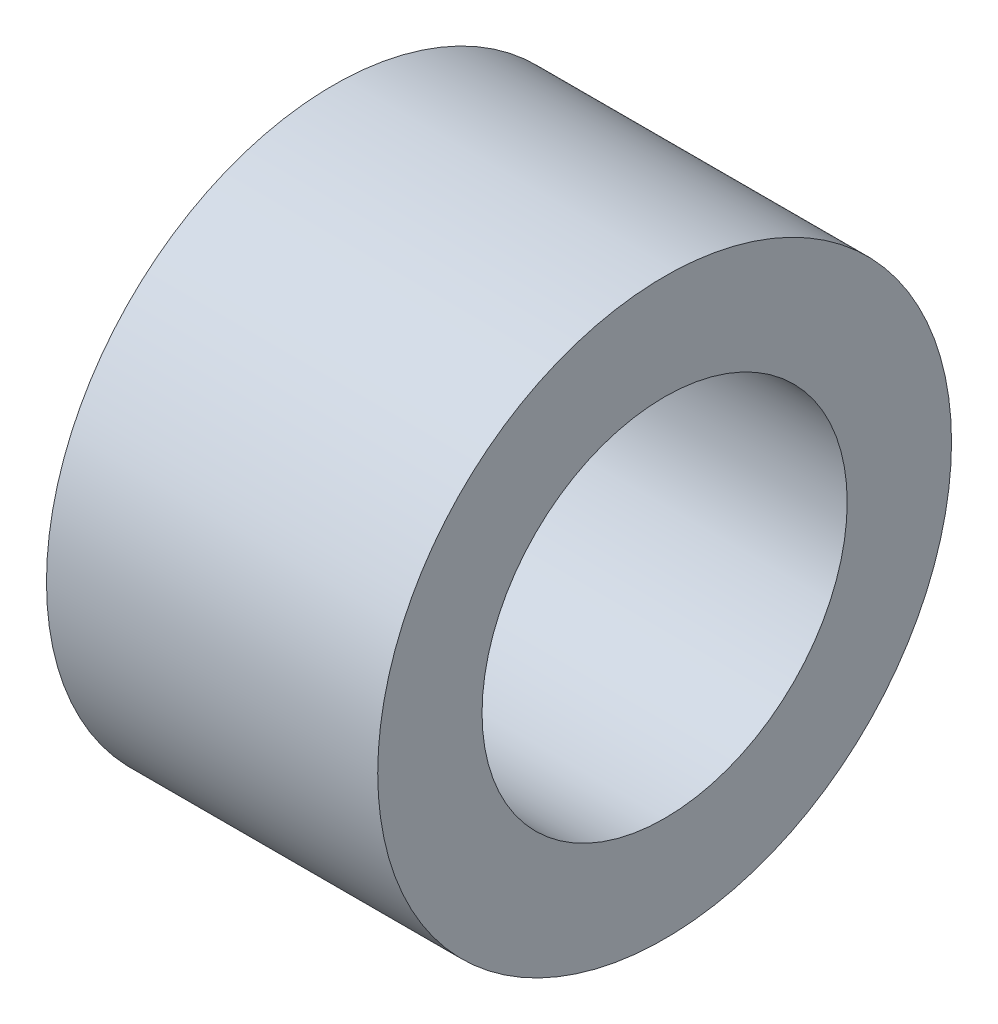
ISO-10303-21;
HEADER;
FILE_DESCRIPTION(('STEP AP214'),'2;1');
FILE_NAME('part.step','',(''),(''),'','','');
FILE_SCHEMA(('AUTOMOTIVE_DESIGN { 1 0 10303 214 1 1 1 1 }'));
ENDSEC;
DATA;
#1=APPLICATION_CONTEXT('core data for automotive mechanical design processes');
#2=APPLICATION_PROTOCOL_DEFINITION('international standard','automotive_design',2000,#1);
#3=PRODUCT_CONTEXT('',#1,'mechanical');
#4=PRODUCT('Part','Part','',(#3));
#5=PRODUCT_RELATED_PRODUCT_CATEGORY('part','',(#4));
#6=PRODUCT_DEFINITION_FORMATION('','',#4);
#7=PRODUCT_DEFINITION_CONTEXT('part definition',#1,'design');
#8=PRODUCT_DEFINITION('design','',#6,#7);
#9=PRODUCT_DEFINITION_SHAPE('','',#8);
#10=(LENGTH_UNIT() NAMED_UNIT(*) SI_UNIT(.MILLI.,.METRE.));
#11=(NAMED_UNIT(*) PLANE_ANGLE_UNIT() SI_UNIT($,.RADIAN.));
#12=(NAMED_UNIT(*) SI_UNIT($,.STERADIAN.) SOLID_ANGLE_UNIT());
#13=UNCERTAINTY_MEASURE_WITH_UNIT(LENGTH_MEASURE(1.E-05),#10,'distance_accuracy_value','');
#14=(GEOMETRIC_REPRESENTATION_CONTEXT(3) GLOBAL_UNCERTAINTY_ASSIGNED_CONTEXT((#13)) GLOBAL_UNIT_ASSIGNED_CONTEXT((#10,
#11,#12)) REPRESENTATION_CONTEXT('',''));
#15=CARTESIAN_POINT('',(0.,0.,0.));
#16=DIRECTION('',(0.,0.,1.));
#17=DIRECTION('',(1.,0.,0.));
#18=AXIS2_PLACEMENT_3D('',#15,#16,#17);
#19=CARTESIAN_POINT('',(0.,11.,0.));
#20=DIRECTION('',(1.,0.,0.));
#21=DIRECTION('',(0.,0.,-1.));
#22=AXIS2_PLACEMENT_3D('',#19,#20,#21);
#23=PLANE('',#22);
#24=CARTESIAN_POINT('',(0.,0.,0.));
#25=DIRECTION('',(-1.,0.,0.));
#26=DIRECTION('',(0.,0.,1.));
#27=AXIS2_PLACEMENT_3D('',#24,#25,#26);
#28=CIRCLE('',#27,7.);
#29=CARTESIAN_POINT('',(0.,0.,7.));
#30=VERTEX_POINT('',#29);
#31=EDGE_CURVE('E10',#30,#30,#28,.T.);
#32=ORIENTED_EDGE('',*,*,#31,.F.);
#33=EDGE_LOOP('',(#32));
#34=FACE_BOUND('',#33,.T.);
#35=CARTESIAN_POINT('',(0.,0.,0.));
#36=DIRECTION('',(-1.,0.,0.));
#37=DIRECTION('',(0.,0.,1.));
#38=AXIS2_PLACEMENT_3D('',#35,#36,#37);
#39=CIRCLE('',#38,11.);
#40=CARTESIAN_POINT('',(0.,0.,11.));
#41=VERTEX_POINT('',#40);
#42=EDGE_CURVE('E52',#41,#41,#39,.T.);
#43=ORIENTED_EDGE('',*,*,#42,.T.);
#44=EDGE_LOOP('',(#43));
#45=FACE_BOUND('',#44,.T.);
#46=ADVANCED_FACE('F39',(#34,#45),#23,.F.);
#47=CARTESIAN_POINT('',(-3000.,0.,0.));
#48=DIRECTION('',(-1.,0.,0.));
#49=DIRECTION('',(0.,0.,1.));
#50=AXIS2_PLACEMENT_3D('',#47,#48,#49);
#51=CYLINDRICAL_SURFACE('',#50,7.);
#52=CARTESIAN_POINT('',(12.7000000000002,0.,0.));
#53=DIRECTION('',(-1.,0.,0.));
#54=DIRECTION('',(0.,0.,1.));
#55=AXIS2_PLACEMENT_3D('',#52,#53,#54);
#56=CIRCLE('',#55,7.);
#57=CARTESIAN_POINT('',(12.7000000000002,0.,7.));
#58=VERTEX_POINT('',#57);
#59=EDGE_CURVE('E44',#58,#58,#56,.T.);
#60=ORIENTED_EDGE('',*,*,#59,.F.);
#61=EDGE_LOOP('',(#60));
#62=FACE_BOUND('',#61,.T.);
#63=ORIENTED_EDGE('',*,*,#31,.T.);
#64=EDGE_LOOP('',(#63));
#65=FACE_BOUND('',#64,.T.);
#66=ADVANCED_FACE('F67',(#62,#65),#51,.F.);
#67=CARTESIAN_POINT('',(12.7,7.,0.));
#68=DIRECTION('',(-1.,0.,0.));
#69=DIRECTION('',(0.,0.,1.));
#70=AXIS2_PLACEMENT_3D('',#67,#68,#69);
#71=PLANE('',#70);
#72=CARTESIAN_POINT('',(12.7000000000002,0.,0.));
#73=DIRECTION('',(-1.,0.,0.));
#74=DIRECTION('',(0.,0.,1.));
#75=AXIS2_PLACEMENT_3D('',#72,#73,#74);
#76=CIRCLE('',#75,11.);
#77=CARTESIAN_POINT('',(12.7000000000002,0.,11.));
#78=VERTEX_POINT('',#77);
#79=EDGE_CURVE('E47',#78,#78,#76,.T.);
#80=ORIENTED_EDGE('',*,*,#79,.F.);
#81=EDGE_LOOP('',(#80));
#82=FACE_BOUND('',#81,.T.);
#83=ORIENTED_EDGE('',*,*,#59,.T.);
#84=EDGE_LOOP('',(#83));
#85=FACE_BOUND('',#84,.T.);
#86=ADVANCED_FACE('F64',(#82,#85),#71,.F.);
#87=CARTESIAN_POINT('',(-3000.,0.,0.));
#88=DIRECTION('',(-1.,0.,0.));
#89=DIRECTION('',(0.,0.,1.));
#90=AXIS2_PLACEMENT_3D('',#87,#88,#89);
#91=CYLINDRICAL_SURFACE('',#90,11.);
#92=ORIENTED_EDGE('',*,*,#42,.F.);
#93=EDGE_LOOP('',(#92));
#94=FACE_BOUND('',#93,.T.);
#95=ORIENTED_EDGE('',*,*,#79,.T.);
#96=EDGE_LOOP('',(#95));
#97=FACE_BOUND('',#96,.T.);
#98=ADVANCED_FACE('F58',(#94,#97),#91,.T.);
#99=CLOSED_SHELL('',(#46,#66,#86,#98));
#100=MANIFOLD_SOLID_BREP('B2',#99);
#101=ADVANCED_BREP_SHAPE_REPRESENTATION('',(#18,#100),#14);
#102=SHAPE_DEFINITION_REPRESENTATION(#9,#101);
ENDSEC;
END-ISO-10303-21;
